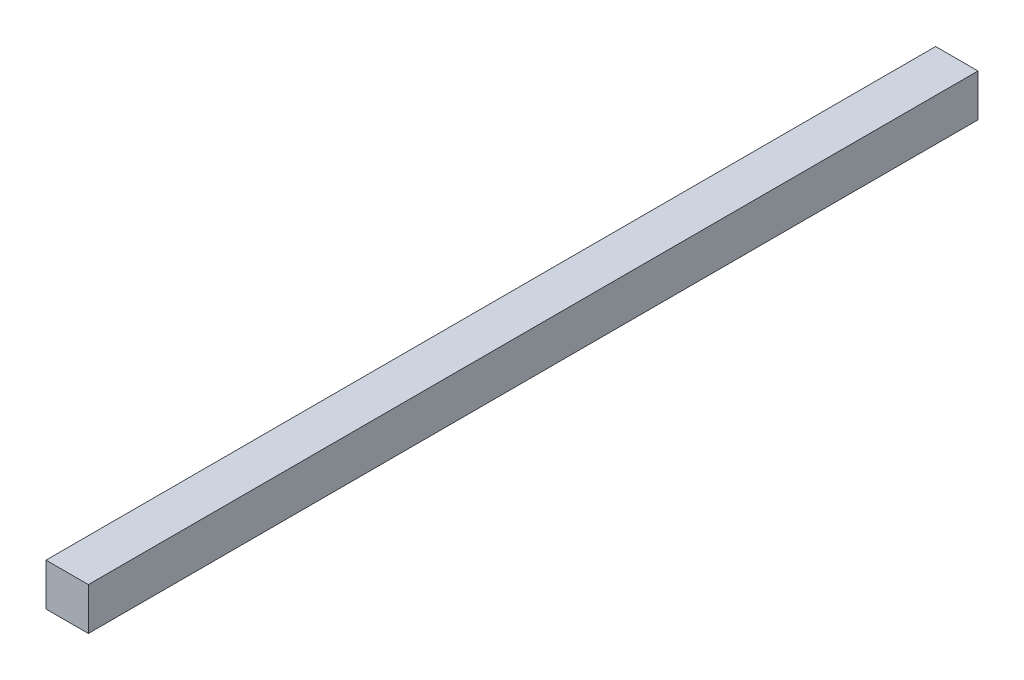
ISO-10303-21;
HEADER;
FILE_DESCRIPTION(('STEP AP214'),'2;1');
FILE_NAME('part.step','',(''),(''),'','','');
FILE_SCHEMA(('AUTOMOTIVE_DESIGN { 1 0 10303 214 1 1 1 1 }'));
ENDSEC;
DATA;
#1=APPLICATION_CONTEXT('core data for automotive mechanical design processes');
#2=APPLICATION_PROTOCOL_DEFINITION('international standard','automotive_design',2000,#1);
#3=PRODUCT_CONTEXT('',#1,'mechanical');
#4=PRODUCT('Part','Part','',(#3));
#5=PRODUCT_RELATED_PRODUCT_CATEGORY('part','',(#4));
#6=PRODUCT_DEFINITION_FORMATION('','',#4);
#7=PRODUCT_DEFINITION_CONTEXT('part definition',#1,'design');
#8=PRODUCT_DEFINITION('design','',#6,#7);
#9=PRODUCT_DEFINITION_SHAPE('','',#8);
#10=(LENGTH_UNIT() NAMED_UNIT(*) SI_UNIT(.MILLI.,.METRE.));
#11=(NAMED_UNIT(*) PLANE_ANGLE_UNIT() SI_UNIT($,.RADIAN.));
#12=(NAMED_UNIT(*) SI_UNIT($,.STERADIAN.) SOLID_ANGLE_UNIT());
#13=UNCERTAINTY_MEASURE_WITH_UNIT(LENGTH_MEASURE(1.E-05),#10,'distance_accuracy_value','');
#14=(GEOMETRIC_REPRESENTATION_CONTEXT(3) GLOBAL_UNCERTAINTY_ASSIGNED_CONTEXT((#13)) GLOBAL_UNIT_ASSIGNED_CONTEXT((#10,
#11,#12)) REPRESENTATION_CONTEXT('',''));
#15=CARTESIAN_POINT('',(0.,0.,0.));
#16=DIRECTION('',(0.,0.,1.));
#17=DIRECTION('',(1.,0.,0.));
#18=AXIS2_PLACEMENT_3D('',#15,#16,#17);
#19=CARTESIAN_POINT('',(0.,0.,53.34));
#20=DIRECTION('',(-1.,0.,0.));
#21=DIRECTION('',(0.,-1.,0.));
#22=AXIS2_PLACEMENT_3D('',#19,#20,#21);
#23=PLANE('',#22);
#24=DIRECTION('',(0.,1.,0.));
#25=VECTOR('',#24,1.);
#26=CARTESIAN_POINT('',(0.,0.,0.));
#27=LINE('',#26,#25);
#28=CARTESIAN_POINT('',(0.,0.,0.));
#29=VERTEX_POINT('',#28);
#30=CARTESIAN_POINT('',(0.,2.54,0.));
#31=VERTEX_POINT('',#30);
#32=EDGE_CURVE('E107',#29,#31,#27,.T.);
#33=ORIENTED_EDGE('',*,*,#32,.T.);
#34=DIRECTION('',(0.,0.,-1.));
#35=VECTOR('',#34,1.);
#36=CARTESIAN_POINT('',(0.,2.54,53.34));
#37=LINE('',#36,#35);
#38=CARTESIAN_POINT('',(0.,2.54,53.34));
#39=VERTEX_POINT('',#38);
#40=EDGE_CURVE('E11',#39,#31,#37,.T.);
#41=ORIENTED_EDGE('',*,*,#40,.F.);
#42=DIRECTION('',(0.,1.,0.));
#43=VECTOR('',#42,1.);
#44=CARTESIAN_POINT('',(0.,0.,53.34));
#45=LINE('',#44,#43);
#46=CARTESIAN_POINT('',(0.,0.,53.34));
#47=VERTEX_POINT('',#46);
#48=EDGE_CURVE('E91',#47,#39,#45,.T.);
#49=ORIENTED_EDGE('',*,*,#48,.F.);
#50=DIRECTION('',(0.,0.,-1.));
#51=VECTOR('',#50,1.);
#52=CARTESIAN_POINT('',(0.,0.,53.34));
#53=LINE('',#52,#51);
#54=EDGE_CURVE('E103',#47,#29,#53,.T.);
#55=ORIENTED_EDGE('',*,*,#54,.T.);
#56=EDGE_LOOP('',(#33,#41,#49,#55));
#57=FACE_BOUND('',#56,.T.);
#58=ADVANCED_FACE('F39',(#57),#23,.F.);
#59=CARTESIAN_POINT('',(0.,2.54,53.34));
#60=DIRECTION('',(0.,-1.,0.));
#61=DIRECTION('',(1.,0.,0.));
#62=AXIS2_PLACEMENT_3D('',#59,#60,#61);
#63=PLANE('',#62);
#64=DIRECTION('',(-1.,0.,0.));
#65=VECTOR('',#64,1.);
#66=CARTESIAN_POINT('',(0.,2.54,0.));
#67=LINE('',#66,#65);
#68=CARTESIAN_POINT('',(-2.54,2.54,0.));
#69=VERTEX_POINT('',#68);
#70=EDGE_CURVE('E96',#31,#69,#67,.T.);
#71=ORIENTED_EDGE('',*,*,#70,.T.);
#72=DIRECTION('',(0.,0.,-1.));
#73=VECTOR('',#72,1.);
#74=CARTESIAN_POINT('',(-2.54,2.54,53.34));
#75=LINE('',#74,#73);
#76=CARTESIAN_POINT('',(-2.54,2.54,53.34));
#77=VERTEX_POINT('',#76);
#78=EDGE_CURVE('E48',#77,#69,#75,.T.);
#79=ORIENTED_EDGE('',*,*,#78,.F.);
#80=DIRECTION('',(-1.,0.,0.));
#81=VECTOR('',#80,1.);
#82=CARTESIAN_POINT('',(0.,2.54,53.34));
#83=LINE('',#82,#81);
#84=EDGE_CURVE('E86',#39,#77,#83,.T.);
#85=ORIENTED_EDGE('',*,*,#84,.F.);
#86=ORIENTED_EDGE('',*,*,#40,.T.);
#87=EDGE_LOOP('',(#71,#79,#85,#86));
#88=FACE_BOUND('',#87,.T.);
#89=ADVANCED_FACE('F95',(#88),#63,.F.);
#90=CARTESIAN_POINT('',(-2.54,0.,53.34));
#91=DIRECTION('',(1.,0.,0.));
#92=DIRECTION('',(0.,0.,-1.));
#93=AXIS2_PLACEMENT_3D('',#90,#91,#92);
#94=PLANE('',#93);
#95=DIRECTION('',(0.,-1.,0.));
#96=VECTOR('',#95,1.);
#97=CARTESIAN_POINT('',(-2.54,0.,0.));
#98=LINE('',#97,#96);
#99=CARTESIAN_POINT('',(-2.54,0.,0.));
#100=VERTEX_POINT('',#99);
#101=EDGE_CURVE('E73',#69,#100,#98,.T.);
#102=ORIENTED_EDGE('',*,*,#101,.T.);
#103=DIRECTION('',(0.,0.,-1.));
#104=VECTOR('',#103,1.);
#105=CARTESIAN_POINT('',(-2.54,0.,53.34));
#106=LINE('',#105,#104);
#107=CARTESIAN_POINT('',(-2.54,0.,53.34));
#108=VERTEX_POINT('',#107);
#109=EDGE_CURVE('E98',#108,#100,#106,.T.);
#110=ORIENTED_EDGE('',*,*,#109,.F.);
#111=DIRECTION('',(0.,-1.,0.));
#112=VECTOR('',#111,1.);
#113=CARTESIAN_POINT('',(-2.54,0.,53.34));
#114=LINE('',#113,#112);
#115=EDGE_CURVE('E89',#77,#108,#114,.T.);
#116=ORIENTED_EDGE('',*,*,#115,.F.);
#117=ORIENTED_EDGE('',*,*,#78,.T.);
#118=EDGE_LOOP('',(#102,#110,#116,#117));
#119=FACE_BOUND('',#118,.T.);
#120=ADVANCED_FACE('F99',(#119),#94,.F.);
#121=CARTESIAN_POINT('',(0.,0.,53.34));
#122=DIRECTION('',(0.,1.,0.));
#123=DIRECTION('',(0.,0.,1.));
#124=AXIS2_PLACEMENT_3D('',#121,#122,#123);
#125=PLANE('',#124);
#126=DIRECTION('',(1.,0.,0.));
#127=VECTOR('',#126,1.);
#128=CARTESIAN_POINT('',(0.,0.,0.));
#129=LINE('',#128,#127);
#130=EDGE_CURVE('E79',#100,#29,#129,.T.);
#131=ORIENTED_EDGE('',*,*,#130,.T.);
#132=ORIENTED_EDGE('',*,*,#54,.F.);
#133=DIRECTION('',(1.,0.,0.));
#134=VECTOR('',#133,1.);
#135=CARTESIAN_POINT('',(0.,0.,53.34));
#136=LINE('',#135,#134);
#137=EDGE_CURVE('E56',#108,#47,#136,.T.);
#138=ORIENTED_EDGE('',*,*,#137,.F.);
#139=ORIENTED_EDGE('',*,*,#109,.T.);
#140=EDGE_LOOP('',(#131,#132,#138,#139));
#141=FACE_BOUND('',#140,.T.);
#142=ADVANCED_FACE('F120',(#141),#125,.F.);
#143=CARTESIAN_POINT('',(0.,0.,53.34));
#144=DIRECTION('',(0.,0.,1.));
#145=DIRECTION('',(1.,0.,0.));
#146=AXIS2_PLACEMENT_3D('',#143,#144,#145);
#147=PLANE('',#146);
#148=ORIENTED_EDGE('',*,*,#48,.T.);
#149=ORIENTED_EDGE('',*,*,#84,.T.);
#150=ORIENTED_EDGE('',*,*,#115,.T.);
#151=ORIENTED_EDGE('',*,*,#137,.T.);
#152=EDGE_LOOP('',(#148,#149,#150,#151));
#153=FACE_BOUND('',#152,.T.);
#154=ADVANCED_FACE('F87',(#153),#147,.T.);
#155=CARTESIAN_POINT('',(0.,0.,0.));
#156=DIRECTION('',(0.,0.,1.));
#157=DIRECTION('',(1.,0.,0.));
#158=AXIS2_PLACEMENT_3D('',#155,#156,#157);
#159=PLANE('',#158);
#160=ORIENTED_EDGE('',*,*,#32,.F.);
#161=ORIENTED_EDGE('',*,*,#130,.F.);
#162=ORIENTED_EDGE('',*,*,#101,.F.);
#163=ORIENTED_EDGE('',*,*,#70,.F.);
#164=EDGE_LOOP('',(#160,#161,#162,#163));
#165=FACE_BOUND('',#164,.T.);
#166=ADVANCED_FACE('F123',(#165),#159,.F.);
#167=CLOSED_SHELL('',(#58,#89,#120,#142,#154,#166));
#168=MANIFOLD_SOLID_BREP('B2',#167);
#169=ADVANCED_BREP_SHAPE_REPRESENTATION('',(#18,#168),#14);
#170=SHAPE_DEFINITION_REPRESENTATION(#9,#169);
ENDSEC;
END-ISO-10303-21;
